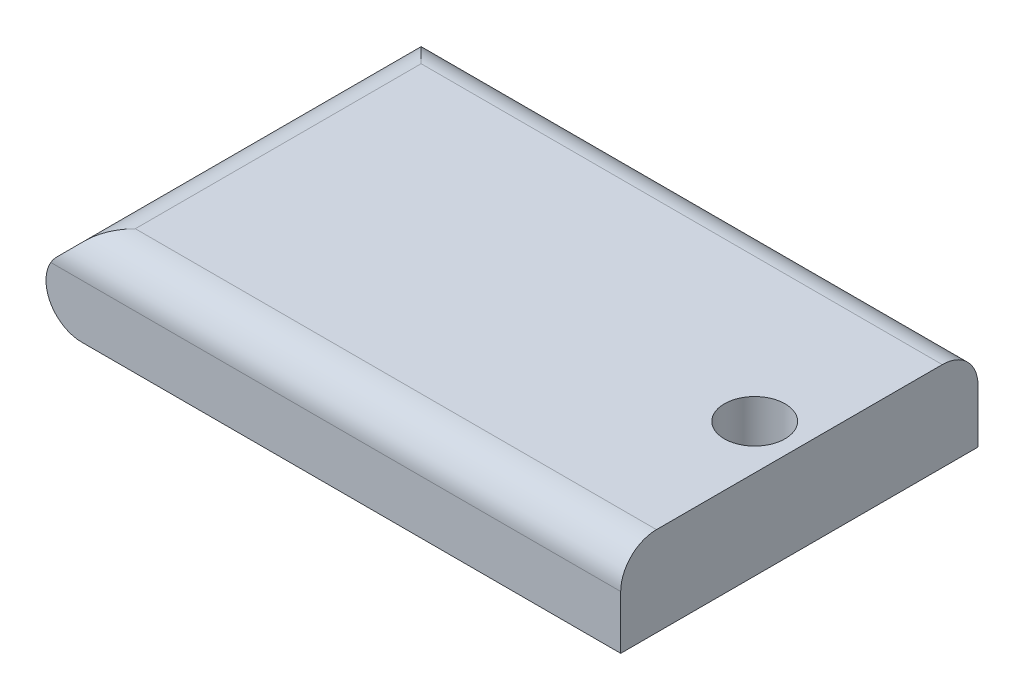
ISO-10303-21;
HEADER;
FILE_DESCRIPTION(('STEP AP214'),'2;1');
FILE_NAME('part.step','',(''),(''),'','','');
FILE_SCHEMA(('AUTOMOTIVE_DESIGN { 1 0 10303 214 1 1 1 1 }'));
ENDSEC;
DATA;
#1=APPLICATION_CONTEXT('core data for automotive mechanical design processes');
#2=APPLICATION_PROTOCOL_DEFINITION('international standard','automotive_design',2000,#1);
#3=PRODUCT_CONTEXT('',#1,'mechanical');
#4=PRODUCT('Part','Part','',(#3));
#5=PRODUCT_RELATED_PRODUCT_CATEGORY('part','',(#4));
#6=PRODUCT_DEFINITION_FORMATION('','',#4);
#7=PRODUCT_DEFINITION_CONTEXT('part definition',#1,'design');
#8=PRODUCT_DEFINITION('design','',#6,#7);
#9=PRODUCT_DEFINITION_SHAPE('','',#8);
#10=(LENGTH_UNIT() NAMED_UNIT(*) SI_UNIT(.MILLI.,.METRE.));
#11=(NAMED_UNIT(*) PLANE_ANGLE_UNIT() SI_UNIT($,.RADIAN.));
#12=(NAMED_UNIT(*) SI_UNIT($,.STERADIAN.) SOLID_ANGLE_UNIT());
#13=UNCERTAINTY_MEASURE_WITH_UNIT(LENGTH_MEASURE(1.E-05),#10,'distance_accuracy_value','');
#14=(GEOMETRIC_REPRESENTATION_CONTEXT(3) GLOBAL_UNCERTAINTY_ASSIGNED_CONTEXT((#13)) GLOBAL_UNIT_ASSIGNED_CONTEXT((#10,
#11,#12)) REPRESENTATION_CONTEXT('',''));
#15=CARTESIAN_POINT('',(0.,0.,0.));
#16=DIRECTION('',(0.,0.,1.));
#17=DIRECTION('',(1.,0.,0.));
#18=AXIS2_PLACEMENT_3D('',#15,#16,#17);
#19=CARTESIAN_POINT('',(0.,5.,20.));
#20=DIRECTION('',(-1.,0.,0.));
#21=DIRECTION('',(0.,-1.,0.));
#22=AXIS2_PLACEMENT_3D('',#19,#20,#21);
#23=PLANE('',#22);
#24=DIRECTION('',(0.,1.,0.));
#25=VECTOR('',#24,1.);
#26=CARTESIAN_POINT('',(0.,5.,0.));
#27=LINE('',#26,#25);
#28=CARTESIAN_POINT('',(0.,0.,0.));
#29=VERTEX_POINT('',#28);
#30=CARTESIAN_POINT('',(0.,3.,0.));
#31=VERTEX_POINT('',#30);
#32=EDGE_CURVE('E126',#29,#31,#27,.T.);
#33=ORIENTED_EDGE('',*,*,#32,.T.);
#34=CARTESIAN_POINT('',(0.,3.,2.));
#35=DIRECTION('',(-1.,0.,0.));
#36=DIRECTION('',(0.,-1.,0.));
#37=AXIS2_PLACEMENT_3D('',#34,#35,#36);
#38=CIRCLE('',#37,2.);
#39=CARTESIAN_POINT('',(0.,5.,2.));
#40=VERTEX_POINT('',#39);
#41=EDGE_CURVE('E152',#31,#40,#38,.F.);
#42=ORIENTED_EDGE('',*,*,#41,.T.);
#43=DIRECTION('',(0.,0.,-1.));
#44=VECTOR('',#43,1.);
#45=CARTESIAN_POINT('',(0.,5.,20.));
#46=LINE('',#45,#44);
#47=CARTESIAN_POINT('',(0.,5.,18.));
#48=VERTEX_POINT('',#47);
#49=EDGE_CURVE('E120',#48,#40,#46,.T.);
#50=ORIENTED_EDGE('',*,*,#49,.F.);
#51=CARTESIAN_POINT('',(0.,3.,18.));
#52=DIRECTION('',(-1.,0.,0.));
#53=DIRECTION('',(0.,-1.,0.));
#54=AXIS2_PLACEMENT_3D('',#51,#52,#53);
#55=CIRCLE('',#54,2.);
#56=CARTESIAN_POINT('',(0.,3.,20.));
#57=VERTEX_POINT('',#56);
#58=EDGE_CURVE('E124',#48,#57,#55,.F.);
#59=ORIENTED_EDGE('',*,*,#58,.T.);
#60=DIRECTION('',(0.,1.,0.));
#61=VECTOR('',#60,1.);
#62=CARTESIAN_POINT('',(0.,5.,20.));
#63=LINE('',#62,#61);
#64=CARTESIAN_POINT('',(0.,0.,20.));
#65=VERTEX_POINT('',#64);
#66=EDGE_CURVE('E106',#65,#57,#63,.T.);
#67=ORIENTED_EDGE('',*,*,#66,.F.);
#68=DIRECTION('',(0.,0.,-1.));
#69=VECTOR('',#68,1.);
#70=CARTESIAN_POINT('',(0.,0.,20.));
#71=LINE('',#70,#69);
#72=EDGE_CURVE('E111',#65,#29,#71,.T.);
#73=ORIENTED_EDGE('',*,*,#72,.T.);
#74=EDGE_LOOP('',(#33,#42,#50,#59,#67,#73));
#75=FACE_BOUND('',#74,.T.);
#76=ADVANCED_FACE('F36',(#75),#23,.F.);
#77=CARTESIAN_POINT('',(-30.,5.,20.));
#78=DIRECTION('',(0.,-1.,0.));
#79=DIRECTION('',(0.,0.,-1.));
#80=AXIS2_PLACEMENT_3D('',#77,#78,#79);
#81=PLANE('',#80);
#82=ORIENTED_EDGE('',*,*,#49,.T.);
#83=DIRECTION('',(-1.,0.,0.));
#84=VECTOR('',#83,1.);
#85=CARTESIAN_POINT('',(-30.,5.,2.));
#86=LINE('',#85,#84);
#87=CARTESIAN_POINT('',(-29.1715728752538,5.,2.));
#88=VERTEX_POINT('',#87);
#89=EDGE_CURVE('E140',#40,#88,#86,.T.);
#90=ORIENTED_EDGE('',*,*,#89,.T.);
#91=DIRECTION('',(0.,0.,-1.));
#92=VECTOR('',#91,1.);
#93=CARTESIAN_POINT('',(-29.1715728752538,5.,20.));
#94=LINE('',#93,#92);
#95=CARTESIAN_POINT('',(-29.1715728752538,5.,18.));
#96=VERTEX_POINT('',#95);
#97=EDGE_CURVE('E136',#88,#96,#94,.F.);
#98=ORIENTED_EDGE('',*,*,#97,.T.);
#99=DIRECTION('',(-1.,0.,0.));
#100=VECTOR('',#99,1.);
#101=CARTESIAN_POINT('',(-30.,5.,18.));
#102=LINE('',#101,#100);
#103=EDGE_CURVE('E138',#96,#48,#102,.F.);
#104=ORIENTED_EDGE('',*,*,#103,.T.);
#105=EDGE_LOOP('',(#82,#90,#98,#104));
#106=FACE_BOUND('',#105,.T.);
#107=CARTESIAN_POINT('',(-2.5,5.,10.));
#108=DIRECTION('',(0.,1.,0.));
#109=DIRECTION('',(0.,0.,1.));
#110=AXIS2_PLACEMENT_3D('',#107,#108,#109);
#111=CIRCLE('',#110,1.7);
#112=CARTESIAN_POINT('',(-2.5,5.,11.7));
#113=VERTEX_POINT('',#112);
#114=EDGE_CURVE('E129',#113,#113,#111,.T.);
#115=ORIENTED_EDGE('',*,*,#114,.F.);
#116=EDGE_LOOP('',(#115));
#117=FACE_BOUND('',#116,.T.);
#118=ADVANCED_FACE('F197',(#106,#117),#81,.F.);
#119=CARTESIAN_POINT('',(-35.,0.,20.));
#120=DIRECTION('',(0.707106781186548,-0.707106781186548,0.));
#121=DIRECTION('',(0.707106781186548,0.707106781186548,0.));
#122=AXIS2_PLACEMENT_3D('',#119,#120,#121);
#123=PLANE('',#122);
#124=CARTESIAN_POINT('',(-32.,3.,2.));
#125=DIRECTION('',(0.707106781186548,-0.707106781186548,0.));
#126=DIRECTION('',(0.707106781186548,0.707106781186548,0.));
#127=AXIS2_PLACEMENT_3D('',#124,#125,#126);
#128=ELLIPSE('',#127,2.82842712474619,2.);
#129=CARTESIAN_POINT('',(-30.5857864376269,4.41421356237309,0.585786437626905));
#130=VERTEX_POINT('',#129);
#131=CARTESIAN_POINT('',(-31.5857864376269,3.41421356237309,0.0433633130429659));
#132=VERTEX_POINT('',#131);
#133=EDGE_CURVE('E147',#130,#132,#128,.F.);
#134=ORIENTED_EDGE('',*,*,#133,.T.);
#135=DIRECTION('',(0.,0.,-1.));
#136=VECTOR('',#135,1.);
#137=CARTESIAN_POINT('',(-31.5857864376269,3.41421356237309,20.));
#138=LINE('',#137,#136);
#139=CARTESIAN_POINT('',(-31.5857864376269,3.4142135623731,19.956636686957));
#140=VERTEX_POINT('',#139);
#141=EDGE_CURVE('E59',#132,#140,#138,.F.);
#142=ORIENTED_EDGE('',*,*,#141,.T.);
#143=CARTESIAN_POINT('',(-32.,3.,18.));
#144=DIRECTION('',(0.707106781186548,-0.707106781186548,0.));
#145=DIRECTION('',(-0.707106781186548,-0.707106781186548,0.));
#146=AXIS2_PLACEMENT_3D('',#143,#144,#145);
#147=ELLIPSE('',#146,2.82842712474619,2.);
#148=CARTESIAN_POINT('',(-30.5857864376269,4.41421356237309,19.4142135623731));
#149=VERTEX_POINT('',#148);
#150=EDGE_CURVE('E145',#140,#149,#147,.F.);
#151=ORIENTED_EDGE('',*,*,#150,.T.);
#152=DIRECTION('',(0.,0.,-1.));
#153=VECTOR('',#152,1.);
#154=CARTESIAN_POINT('',(-30.5857864376269,4.41421356237309,20.));
#155=LINE('',#154,#153);
#156=EDGE_CURVE('E143',#149,#130,#155,.T.);
#157=ORIENTED_EDGE('',*,*,#156,.T.);
#158=EDGE_LOOP('',(#134,#142,#151,#157));
#159=FACE_BOUND('',#158,.T.);
#160=ADVANCED_FACE('F201',(#159),#123,.F.);
#161=CARTESIAN_POINT('',(0.,0.,20.));
#162=DIRECTION('',(0.,1.,0.));
#163=DIRECTION('',(-1.,0.,0.));
#164=AXIS2_PLACEMENT_3D('',#161,#162,#163);
#165=PLANE('',#164);
#166=CARTESIAN_POINT('',(-2.5,0.,10.));
#167=DIRECTION('',(0.,1.,0.));
#168=DIRECTION('',(0.,0.,1.));
#169=AXIS2_PLACEMENT_3D('',#166,#167,#168);
#170=CIRCLE('',#169,1.7);
#171=CARTESIAN_POINT('',(-2.5,0.,11.7));
#172=VERTEX_POINT('',#171);
#173=EDGE_CURVE('E132',#172,#172,#170,.T.);
#174=ORIENTED_EDGE('',*,*,#173,.T.);
#175=EDGE_LOOP('',(#174));
#176=FACE_BOUND('',#175,.T.);
#177=DIRECTION('',(1.,0.,0.));
#178=VECTOR('',#177,1.);
#179=CARTESIAN_POINT('',(0.,0.,20.));
#180=LINE('',#179,#178);
#181=CARTESIAN_POINT('',(-30.1715728752538,0.,20.));
#182=VERTEX_POINT('',#181);
#183=EDGE_CURVE('E102',#182,#65,#180,.T.);
#184=ORIENTED_EDGE('',*,*,#183,.F.);
#185=DIRECTION('',(0.,0.,-1.));
#186=VECTOR('',#185,1.);
#187=CARTESIAN_POINT('',(-30.1715728752538,0.,20.));
#188=LINE('',#187,#186);
#189=CARTESIAN_POINT('',(-30.1715728752538,0.,0.));
#190=VERTEX_POINT('',#189);
#191=EDGE_CURVE('E156',#182,#190,#188,.T.);
#192=ORIENTED_EDGE('',*,*,#191,.T.);
#193=DIRECTION('',(1.,0.,0.));
#194=VECTOR('',#193,1.);
#195=CARTESIAN_POINT('',(0.,0.,0.));
#196=LINE('',#195,#194);
#197=EDGE_CURVE('E116',#190,#29,#196,.T.);
#198=ORIENTED_EDGE('',*,*,#197,.T.);
#199=ORIENTED_EDGE('',*,*,#72,.F.);
#200=EDGE_LOOP('',(#184,#192,#198,#199));
#201=FACE_BOUND('',#200,.T.);
#202=ADVANCED_FACE('F114',(#176,#201),#165,.F.);
#203=CARTESIAN_POINT('',(0.,0.,20.));
#204=DIRECTION('',(0.,0.,-1.));
#205=DIRECTION('',(-1.,0.,0.));
#206=AXIS2_PLACEMENT_3D('',#203,#204,#205);
#207=PLANE('',#206);
#208=DIRECTION('',(-1.,0.,0.));
#209=VECTOR('',#208,1.);
#210=CARTESIAN_POINT('',(0.,3.,20.));
#211=LINE('',#210,#209);
#212=CARTESIAN_POINT('',(-31.9036236828227,3.,20.));
#213=VERTEX_POINT('',#212);
#214=EDGE_CURVE('E154',#57,#213,#211,.T.);
#215=ORIENTED_EDGE('',*,*,#214,.T.);
#216=CARTESIAN_POINT('',(-30.1715728752538,2.,20.));
#217=DIRECTION('',(0.,0.,-1.));
#218=DIRECTION('',(-1.,0.,0.));
#219=AXIS2_PLACEMENT_3D('',#216,#217,#218);
#220=CIRCLE('',#219,2.);
#221=EDGE_CURVE('E11',#213,#182,#220,.F.);
#222=ORIENTED_EDGE('',*,*,#221,.T.);
#223=ORIENTED_EDGE('',*,*,#183,.T.);
#224=ORIENTED_EDGE('',*,*,#66,.T.);
#225=EDGE_LOOP('',(#215,#222,#223,#224));
#226=FACE_BOUND('',#225,.T.);
#227=ADVANCED_FACE('F104',(#226),#207,.F.);
#228=CARTESIAN_POINT('',(0.,0.,0.));
#229=DIRECTION('',(0.,0.,-1.));
#230=DIRECTION('',(-1.,0.,0.));
#231=AXIS2_PLACEMENT_3D('',#228,#229,#230);
#232=PLANE('',#231);
#233=ORIENTED_EDGE('',*,*,#197,.F.);
#234=CARTESIAN_POINT('',(-30.1715728752538,2.,0.));
#235=DIRECTION('',(0.,0.,-1.));
#236=DIRECTION('',(-1.,0.,0.));
#237=AXIS2_PLACEMENT_3D('',#234,#235,#236);
#238=CIRCLE('',#237,2.);
#239=CARTESIAN_POINT('',(-31.9036236828227,3.,0.));
#240=VERTEX_POINT('',#239);
#241=EDGE_CURVE('E163',#190,#240,#238,.T.);
#242=ORIENTED_EDGE('',*,*,#241,.T.);
#243=DIRECTION('',(-1.,0.,0.));
#244=VECTOR('',#243,1.);
#245=CARTESIAN_POINT('',(0.,3.,0.));
#246=LINE('',#245,#244);
#247=EDGE_CURVE('E149',#240,#31,#246,.F.);
#248=ORIENTED_EDGE('',*,*,#247,.T.);
#249=ORIENTED_EDGE('',*,*,#32,.F.);
#250=EDGE_LOOP('',(#233,#242,#248,#249));
#251=FACE_BOUND('',#250,.T.);
#252=ADVANCED_FACE('F193',(#251),#232,.T.);
#253=CARTESIAN_POINT('',(-2.5,0.,10.));
#254=DIRECTION('',(0.,1.,0.));
#255=DIRECTION('',(0.,0.,1.));
#256=AXIS2_PLACEMENT_3D('',#253,#254,#255);
#257=CYLINDRICAL_SURFACE('',#256,1.7);
#258=ORIENTED_EDGE('',*,*,#173,.F.);
#259=EDGE_LOOP('',(#258));
#260=FACE_BOUND('',#259,.T.);
#261=ORIENTED_EDGE('',*,*,#114,.T.);
#262=EDGE_LOOP('',(#261));
#263=FACE_BOUND('',#262,.T.);
#264=ADVANCED_FACE('F185',(#260,#263),#257,.F.);
#265=CARTESIAN_POINT('',(0.,3.,18.));
#266=DIRECTION('',(-1.,0.,0.));
#267=DIRECTION('',(0.,0.,1.));
#268=AXIS2_PLACEMENT_3D('',#265,#266,#267);
#269=CYLINDRICAL_SURFACE('',#268,2.);
#270=ORIENTED_EDGE('',*,*,#150,.F.);
#271=CARTESIAN_POINT('',(-31.5857864376269,3.41421356237309,19.956636686957));
#272=CARTESIAN_POINT('',(-31.6165140109472,3.38348926162779,19.9631421463034));
#273=CARTESIAN_POINT('',(-31.6463002642613,3.35169673966822,19.9691149756491));
#274=CARTESIAN_POINT('',(-31.7036735611577,3.28629208094732,19.9796785501657));
#275=CARTESIAN_POINT('',(-31.7312720063195,3.25269115449334,19.9842768618731));
#276=CARTESIAN_POINT('',(-31.7843047457889,3.18363426296772,19.9918544400113));
#277=CARTESIAN_POINT('',(-31.8097387609911,3.14817805960541,19.9948334979036));
#278=CARTESIAN_POINT('',(-31.8584174382217,3.07540140585502,19.9989131521691));
#279=CARTESIAN_POINT('',(-31.8816489367907,3.03807156514072,20.0000030542674));
#280=CARTESIAN_POINT('',(-31.9036236828227,3.,20.));
#281=B_SPLINE_CURVE_WITH_KNOTS('',3,(#271,#272,#273,#274,#275,#276,#277,#278,#279,#280),
.UNSPECIFIED.,.F.,.F.,(4,2,2,2,4),(0.,0.131800201258261,0.262860900987151,0.393938475592528,
0.525755669747029),.UNSPECIFIED.);
#282=EDGE_CURVE('E45',#140,#213,#281,.T.);
#283=ORIENTED_EDGE('',*,*,#282,.T.);
#284=ORIENTED_EDGE('',*,*,#214,.F.);
#285=ORIENTED_EDGE('',*,*,#58,.F.);
#286=ORIENTED_EDGE('',*,*,#103,.F.);
#287=CARTESIAN_POINT('',(-29.1715728752538,3.,18.));
#288=DIRECTION('',(-0.707106781186547,0.,-0.707106781186547));
#289=DIRECTION('',(0.707106781186547,0.,-0.707106781186547));
#290=AXIS2_PLACEMENT_3D('',#287,#288,#289);
#291=ELLIPSE('',#290,2.82842712474619,2.);
#292=EDGE_CURVE('E159',#149,#96,#291,.T.);
#293=ORIENTED_EDGE('',*,*,#292,.F.);
#294=EDGE_LOOP('',(#270,#283,#284,#285,#286,#293));
#295=FACE_BOUND('',#294,.T.);
#296=ADVANCED_FACE('F181',(#295),#269,.T.);
#297=CARTESIAN_POINT('',(-29.1715728752538,3.,20.));
#298=DIRECTION('',(0.,0.,-1.));
#299=DIRECTION('',(-1.,0.,0.));
#300=AXIS2_PLACEMENT_3D('',#297,#298,#299);
#301=CYLINDRICAL_SURFACE('',#300,2.);
#302=ORIENTED_EDGE('',*,*,#292,.T.);
#303=ORIENTED_EDGE('',*,*,#97,.F.);
#304=CARTESIAN_POINT('',(-29.1715728752538,3.,2.));
#305=DIRECTION('',(0.707106781186547,0.,-0.707106781186547));
#306=DIRECTION('',(-0.707106781186547,0.,-0.707106781186547));
#307=AXIS2_PLACEMENT_3D('',#304,#305,#306);
#308=ELLIPSE('',#307,2.82842712474619,2.);
#309=EDGE_CURVE('E157',#130,#88,#308,.T.);
#310=ORIENTED_EDGE('',*,*,#309,.F.);
#311=ORIENTED_EDGE('',*,*,#156,.F.);
#312=EDGE_LOOP('',(#302,#303,#310,#311));
#313=FACE_BOUND('',#312,.T.);
#314=ADVANCED_FACE('F177',(#313),#301,.T.);
#315=CARTESIAN_POINT('',(-30.,3.,2.));
#316=DIRECTION('',(1.,0.,0.));
#317=DIRECTION('',(0.,0.,-1.));
#318=AXIS2_PLACEMENT_3D('',#315,#316,#317);
#319=CYLINDRICAL_SURFACE('',#318,2.);
#320=ORIENTED_EDGE('',*,*,#247,.F.);
#321=CARTESIAN_POINT('',(-31.9036236828227,3.,0.));
#322=CARTESIAN_POINT('',(-31.8816489367907,3.03807156514072,-3.05426740413537E-06));
#323=CARTESIAN_POINT('',(-31.8584174382217,3.07540140585502,0.00108684783086966));
#324=CARTESIAN_POINT('',(-31.8097387609911,3.14817805960541,0.00516650209639121));
#325=CARTESIAN_POINT('',(-31.7843047457889,3.18363426296772,0.00814555998874721));
#326=CARTESIAN_POINT('',(-31.7312720063195,3.25269115449334,0.0157231381268505));
#327=CARTESIAN_POINT('',(-31.7036735611577,3.28629208094732,0.0203214498342633));
#328=CARTESIAN_POINT('',(-31.6463002642613,3.35169673966822,0.0308850243508989));
#329=CARTESIAN_POINT('',(-31.6165140109472,3.38348926162779,0.0368578536965803));
#330=CARTESIAN_POINT('',(-31.5857864376269,3.41421356237309,0.0433633130429662));
#331=B_SPLINE_CURVE_WITH_KNOTS('',3,(#321,#322,#323,#324,#325,#326,#327,#328,#329,#330),
.UNSPECIFIED.,.F.,.F.,(4,2,2,2,4),(0.,0.131817194154499,0.262894768759876,0.393955468488763,
0.525755669747026),.UNSPECIFIED.);
#332=EDGE_CURVE('E165',#240,#132,#331,.T.);
#333=ORIENTED_EDGE('',*,*,#332,.T.);
#334=ORIENTED_EDGE('',*,*,#133,.F.);
#335=ORIENTED_EDGE('',*,*,#309,.T.);
#336=ORIENTED_EDGE('',*,*,#89,.F.);
#337=ORIENTED_EDGE('',*,*,#41,.F.);
#338=EDGE_LOOP('',(#320,#333,#334,#335,#336,#337));
#339=FACE_BOUND('',#338,.T.);
#340=ADVANCED_FACE('F172',(#339),#319,.T.);
#341=CARTESIAN_POINT('',(-30.1715728752538,2.,20.));
#342=DIRECTION('',(0.,0.,-1.));
#343=DIRECTION('',(-1.,0.,0.));
#344=AXIS2_PLACEMENT_3D('',#341,#342,#343);
#345=CYLINDRICAL_SURFACE('',#344,2.);
#346=ORIENTED_EDGE('',*,*,#282,.F.);
#347=ORIENTED_EDGE('',*,*,#141,.F.);
#348=ORIENTED_EDGE('',*,*,#332,.F.);
#349=ORIENTED_EDGE('',*,*,#241,.F.);
#350=ORIENTED_EDGE('',*,*,#191,.F.);
#351=ORIENTED_EDGE('',*,*,#221,.F.);
#352=EDGE_LOOP('',(#346,#347,#348,#349,#350,#351));
#353=FACE_BOUND('',#352,.T.);
#354=ADVANCED_FACE('F38',(#353),#345,.T.);
#355=CLOSED_SHELL('',(#76,#118,#160,#202,#227,#252,#264,#296,#314,#340,#354));
#356=MANIFOLD_SOLID_BREP('B2',#355);
#357=ADVANCED_BREP_SHAPE_REPRESENTATION('',(#18,#356),#14);
#358=SHAPE_DEFINITION_REPRESENTATION(#9,#357);
ENDSEC;
END-ISO-10303-21;
